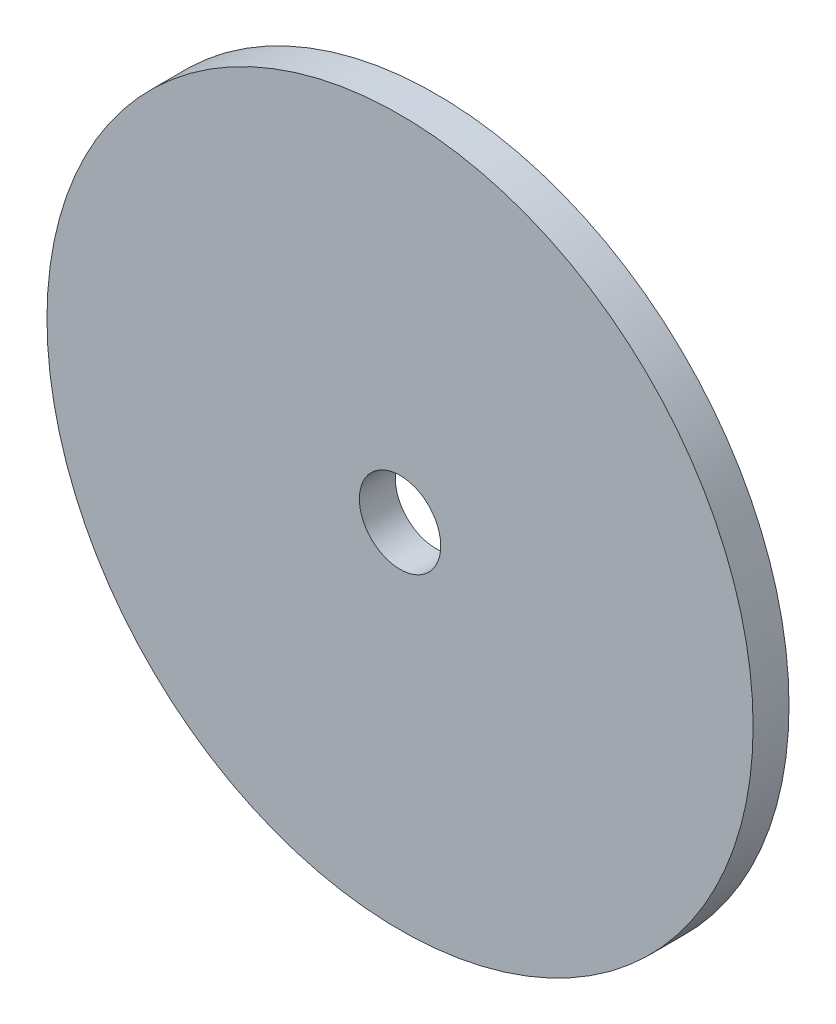
ISO-10303-21;
HEADER;
FILE_DESCRIPTION(('STEP AP214'),'2;1');
FILE_NAME('part.step','',(''),(''),'','','');
FILE_SCHEMA(('AUTOMOTIVE_DESIGN { 1 0 10303 214 1 1 1 1 }'));
ENDSEC;
DATA;
#1=APPLICATION_CONTEXT('core data for automotive mechanical design processes');
#2=APPLICATION_PROTOCOL_DEFINITION('international standard','automotive_design',2000,#1);
#3=PRODUCT_CONTEXT('',#1,'mechanical');
#4=PRODUCT('Part','Part','',(#3));
#5=PRODUCT_RELATED_PRODUCT_CATEGORY('part','',(#4));
#6=PRODUCT_DEFINITION_FORMATION('','',#4);
#7=PRODUCT_DEFINITION_CONTEXT('part definition',#1,'design');
#8=PRODUCT_DEFINITION('design','',#6,#7);
#9=PRODUCT_DEFINITION_SHAPE('','',#8);
#10=(LENGTH_UNIT() NAMED_UNIT(*) SI_UNIT(.MILLI.,.METRE.));
#11=(NAMED_UNIT(*) PLANE_ANGLE_UNIT() SI_UNIT($,.RADIAN.));
#12=(NAMED_UNIT(*) SI_UNIT($,.STERADIAN.) SOLID_ANGLE_UNIT());
#13=UNCERTAINTY_MEASURE_WITH_UNIT(LENGTH_MEASURE(1.E-05),#10,'distance_accuracy_value','');
#14=(GEOMETRIC_REPRESENTATION_CONTEXT(3) GLOBAL_UNCERTAINTY_ASSIGNED_CONTEXT((#13)) GLOBAL_UNIT_ASSIGNED_CONTEXT((#10,
#11,#12)) REPRESENTATION_CONTEXT('',''));
#15=CARTESIAN_POINT('',(0.,0.,0.));
#16=DIRECTION('',(0.,0.,1.));
#17=DIRECTION('',(1.,0.,0.));
#18=AXIS2_PLACEMENT_3D('',#15,#16,#17);
#19=CARTESIAN_POINT('',(0.,0.,3.));
#20=DIRECTION('',(0.,0.,1.));
#21=DIRECTION('',(1.,0.,0.));
#22=AXIS2_PLACEMENT_3D('',#19,#20,#21);
#23=PLANE('',#22);
#24=CARTESIAN_POINT('',(0.,0.,3.));
#25=DIRECTION('',(0.,0.,1.));
#26=DIRECTION('',(1.,0.,0.));
#27=AXIS2_PLACEMENT_3D('',#24,#25,#26);
#28=CIRCLE('',#27,29.5);
#29=CARTESIAN_POINT('',(29.5,0.,3.));
#30=VERTEX_POINT('',#29);
#31=EDGE_CURVE('E10',#30,#30,#28,.T.);
#32=ORIENTED_EDGE('',*,*,#31,.T.);
#33=EDGE_LOOP('',(#32));
#34=FACE_BOUND('',#33,.T.);
#35=CARTESIAN_POINT('',(0.,0.,3.));
#36=DIRECTION('',(0.,0.,1.));
#37=DIRECTION('',(1.,0.,0.));
#38=AXIS2_PLACEMENT_3D('',#35,#36,#37);
#39=CIRCLE('',#38,3.39999999999999);
#40=CARTESIAN_POINT('',(3.39999999999999,0.,3.));
#41=VERTEX_POINT('',#40);
#42=EDGE_CURVE('E41',#41,#41,#39,.T.);
#43=ORIENTED_EDGE('',*,*,#42,.F.);
#44=EDGE_LOOP('',(#43));
#45=FACE_BOUND('',#44,.T.);
#46=ADVANCED_FACE('F30',(#34,#45),#23,.T.);
#47=CARTESIAN_POINT('',(0.,0.,0.));
#48=DIRECTION('',(0.,0.,1.));
#49=DIRECTION('',(1.,0.,0.));
#50=AXIS2_PLACEMENT_3D('',#47,#48,#49);
#51=PLANE('',#50);
#52=CARTESIAN_POINT('',(0.,0.,0.));
#53=DIRECTION('',(0.,0.,1.));
#54=DIRECTION('',(1.,0.,0.));
#55=AXIS2_PLACEMENT_3D('',#52,#53,#54);
#56=CIRCLE('',#55,29.5);
#57=CARTESIAN_POINT('',(29.5,0.,0.));
#58=VERTEX_POINT('',#57);
#59=EDGE_CURVE('E34',#58,#58,#56,.T.);
#60=ORIENTED_EDGE('',*,*,#59,.F.);
#61=EDGE_LOOP('',(#60));
#62=FACE_BOUND('',#61,.T.);
#63=CARTESIAN_POINT('',(0.,0.,0.));
#64=DIRECTION('',(0.,0.,1.));
#65=DIRECTION('',(1.,0.,0.));
#66=AXIS2_PLACEMENT_3D('',#63,#64,#65);
#67=CIRCLE('',#66,3.39999999999999);
#68=CARTESIAN_POINT('',(3.39999999999999,0.,0.));
#69=VERTEX_POINT('',#68);
#70=EDGE_CURVE('E43',#69,#69,#67,.T.);
#71=ORIENTED_EDGE('',*,*,#70,.T.);
#72=EDGE_LOOP('',(#71));
#73=FACE_BOUND('',#72,.T.);
#74=ADVANCED_FACE('F53',(#62,#73),#51,.F.);
#75=CARTESIAN_POINT('',(0.,0.,3.));
#76=DIRECTION('',(0.,0.,-1.));
#77=DIRECTION('',(-1.,0.,0.));
#78=AXIS2_PLACEMENT_3D('',#75,#76,#77);
#79=CYLINDRICAL_SURFACE('',#78,29.5);
#80=ORIENTED_EDGE('',*,*,#31,.F.);
#81=EDGE_LOOP('',(#80));
#82=FACE_BOUND('',#81,.T.);
#83=ORIENTED_EDGE('',*,*,#59,.T.);
#84=EDGE_LOOP('',(#83));
#85=FACE_BOUND('',#84,.T.);
#86=ADVANCED_FACE('F32',(#82,#85),#79,.T.);
#87=CARTESIAN_POINT('',(0.,0.,3.));
#88=DIRECTION('',(0.,0.,-1.));
#89=DIRECTION('',(-1.,0.,0.));
#90=AXIS2_PLACEMENT_3D('',#87,#88,#89);
#91=CYLINDRICAL_SURFACE('',#90,3.39999999999999);
#92=ORIENTED_EDGE('',*,*,#42,.T.);
#93=EDGE_LOOP('',(#92));
#94=FACE_BOUND('',#93,.T.);
#95=ORIENTED_EDGE('',*,*,#70,.F.);
#96=EDGE_LOOP('',(#95));
#97=FACE_BOUND('',#96,.T.);
#98=ADVANCED_FACE('F49',(#94,#97),#91,.F.);
#99=CLOSED_SHELL('',(#46,#74,#86,#98));
#100=MANIFOLD_SOLID_BREP('B2',#99);
#101=ADVANCED_BREP_SHAPE_REPRESENTATION('',(#18,#100),#14);
#102=SHAPE_DEFINITION_REPRESENTATION(#9,#101);
ENDSEC;
END-ISO-10303-21;
